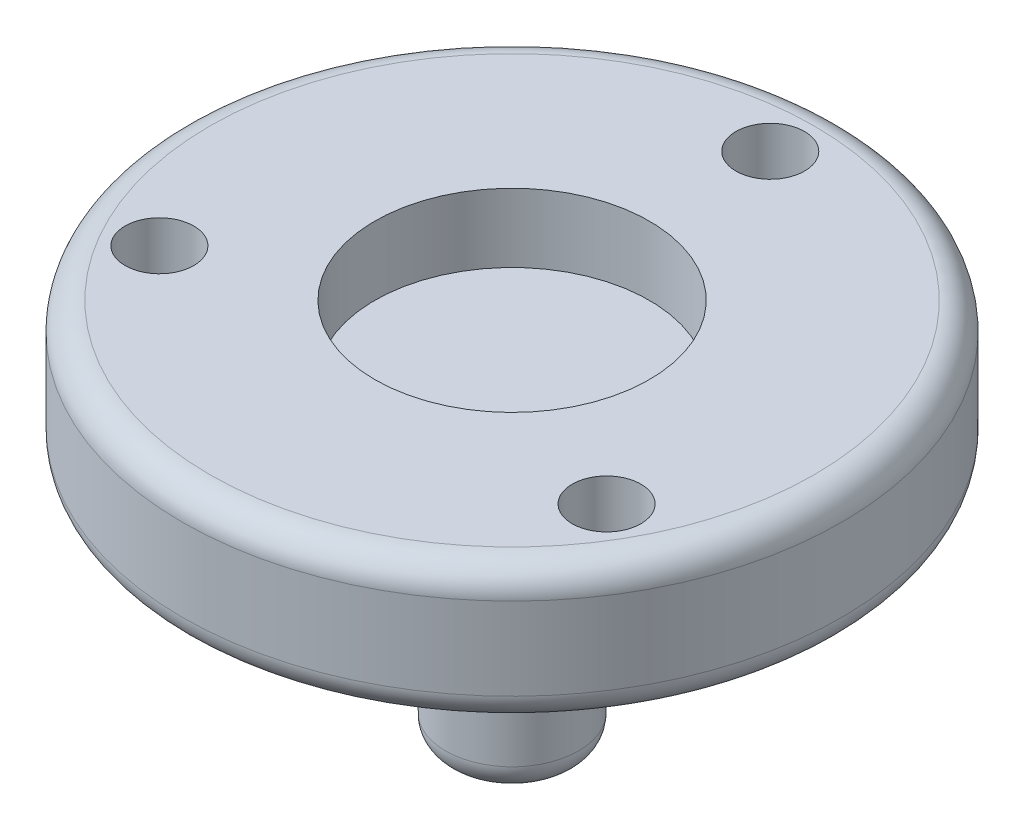
ISO-10303-21;
HEADER;
FILE_DESCRIPTION(('STEP AP214'),'2;1');
FILE_NAME('part.step','',(''),(''),'','','');
FILE_SCHEMA(('AUTOMOTIVE_DESIGN { 1 0 10303 214 1 1 1 1 }'));
ENDSEC;
DATA;
#1=APPLICATION_CONTEXT('core data for automotive mechanical design processes');
#2=APPLICATION_PROTOCOL_DEFINITION('international standard','automotive_design',2000,#1);
#3=PRODUCT_CONTEXT('',#1,'mechanical');
#4=PRODUCT('Part','Part','',(#3));
#5=PRODUCT_RELATED_PRODUCT_CATEGORY('part','',(#4));
#6=PRODUCT_DEFINITION_FORMATION('','',#4);
#7=PRODUCT_DEFINITION_CONTEXT('part definition',#1,'design');
#8=PRODUCT_DEFINITION('design','',#6,#7);
#9=PRODUCT_DEFINITION_SHAPE('','',#8);
#10=(LENGTH_UNIT() NAMED_UNIT(*) SI_UNIT(.MILLI.,.METRE.));
#11=(NAMED_UNIT(*) PLANE_ANGLE_UNIT() SI_UNIT($,.RADIAN.));
#12=(NAMED_UNIT(*) SI_UNIT($,.STERADIAN.) SOLID_ANGLE_UNIT());
#13=UNCERTAINTY_MEASURE_WITH_UNIT(LENGTH_MEASURE(1.E-05),#10,'distance_accuracy_value','');
#14=(GEOMETRIC_REPRESENTATION_CONTEXT(3) GLOBAL_UNCERTAINTY_ASSIGNED_CONTEXT((#13)) GLOBAL_UNIT_ASSIGNED_CONTEXT((#10,
#11,#12)) REPRESENTATION_CONTEXT('',''));
#15=CARTESIAN_POINT('',(0.,0.,0.));
#16=DIRECTION('',(0.,0.,1.));
#17=DIRECTION('',(1.,0.,0.));
#18=AXIS2_PLACEMENT_3D('',#15,#16,#17);
#19=CARTESIAN_POINT('',(0.,6.35,0.));
#20=DIRECTION('',(0.,-1.,0.));
#21=DIRECTION('',(0.,0.,-1.));
#22=AXIS2_PLACEMENT_3D('',#19,#20,#21);
#23=CYLINDRICAL_SURFACE('',#22,15.24);
#24=CARTESIAN_POINT('',(0.,1.27,0.));
#25=DIRECTION('',(0.,1.,0.));
#26=DIRECTION('',(0.,0.,1.));
#27=AXIS2_PLACEMENT_3D('',#24,#25,#26);
#28=CIRCLE('',#27,15.24);
#29=CARTESIAN_POINT('',(0.,1.27,15.24));
#30=VERTEX_POINT('',#29);
#31=EDGE_CURVE('E49',#30,#30,#28,.T.);
#32=ORIENTED_EDGE('',*,*,#31,.T.);
#33=EDGE_LOOP('',(#32));
#34=FACE_BOUND('',#33,.T.);
#35=CARTESIAN_POINT('',(0.,5.08,0.));
#36=DIRECTION('',(0.,1.,0.));
#37=DIRECTION('',(0.,0.,1.));
#38=AXIS2_PLACEMENT_3D('',#35,#36,#37);
#39=CIRCLE('',#38,15.24);
#40=CARTESIAN_POINT('',(0.,5.08,15.24));
#41=VERTEX_POINT('',#40);
#42=EDGE_CURVE('E68',#41,#41,#39,.F.);
#43=ORIENTED_EDGE('',*,*,#42,.T.);
#44=EDGE_LOOP('',(#43));
#45=FACE_BOUND('',#44,.T.);
#46=ADVANCED_FACE('F36',(#34,#45),#23,.T.);
#47=CARTESIAN_POINT('',(0.,6.35,0.));
#48=DIRECTION('',(0.,1.,0.));
#49=DIRECTION('',(0.,0.,1.));
#50=AXIS2_PLACEMENT_3D('',#47,#48,#49);
#51=PLANE('',#50);
#52=CARTESIAN_POINT('',(10.3386112703786,6.35,5.96900000000005));
#53=DIRECTION('',(0.,1.,0.));
#54=DIRECTION('',(-0.866025403784436,0.,-0.500000000000004));
#55=AXIS2_PLACEMENT_3D('',#52,#53,#54);
#56=CIRCLE('',#55,1.5875);
#57=CARTESIAN_POINT('',(8.96379594187081,6.35,5.17525000000004));
#58=VERTEX_POINT('',#57);
#59=EDGE_CURVE('E101',#58,#58,#56,.T.);
#60=ORIENTED_EDGE('',*,*,#59,.F.);
#61=EDGE_LOOP('',(#60));
#62=FACE_BOUND('',#61,.T.);
#63=CARTESIAN_POINT('',(-10.3386112703787,6.35,5.9689999999999));
#64=DIRECTION('',(0.,1.,0.));
#65=DIRECTION('',(0.866025403784443,0.,-0.499999999999992));
#66=AXIS2_PLACEMENT_3D('',#63,#64,#65);
#67=CIRCLE('',#66,1.5875);
#68=CARTESIAN_POINT('',(-8.96379594187088,6.35,5.17524999999992));
#69=VERTEX_POINT('',#68);
#70=EDGE_CURVE('E93',#69,#69,#67,.T.);
#71=ORIENTED_EDGE('',*,*,#70,.F.);
#72=EDGE_LOOP('',(#71));
#73=FACE_BOUND('',#72,.T.);
#74=CARTESIAN_POINT('',(0.,6.35,-11.938));
#75=DIRECTION('',(0.,1.,0.));
#76=DIRECTION('',(0.,0.,1.));
#77=AXIS2_PLACEMENT_3D('',#74,#75,#76);
#78=CIRCLE('',#77,1.5875);
#79=CARTESIAN_POINT('',(0.,6.35,-10.3505));
#80=VERTEX_POINT('',#79);
#81=EDGE_CURVE('E85',#80,#80,#78,.T.);
#82=ORIENTED_EDGE('',*,*,#81,.F.);
#83=EDGE_LOOP('',(#82));
#84=FACE_BOUND('',#83,.T.);
#85=CARTESIAN_POINT('',(0.,6.35,0.));
#86=DIRECTION('',(0.,1.,0.));
#87=DIRECTION('',(0.,0.,1.));
#88=AXIS2_PLACEMENT_3D('',#85,#86,#87);
#89=CIRCLE('',#88,13.97);
#90=CARTESIAN_POINT('',(0.,6.35,13.97));
#91=VERTEX_POINT('',#90);
#92=EDGE_CURVE('E72',#91,#91,#89,.T.);
#93=ORIENTED_EDGE('',*,*,#92,.T.);
#94=EDGE_LOOP('',(#93));
#95=FACE_BOUND('',#94,.T.);
#96=CARTESIAN_POINT('',(0.,6.35,0.));
#97=DIRECTION('',(0.,1.,0.));
#98=DIRECTION('',(0.,0.,1.));
#99=AXIS2_PLACEMENT_3D('',#96,#97,#98);
#100=CIRCLE('',#99,6.35);
#101=CARTESIAN_POINT('',(0.,6.35,6.35));
#102=VERTEX_POINT('',#101);
#103=EDGE_CURVE('E77',#102,#102,#100,.T.);
#104=ORIENTED_EDGE('',*,*,#103,.F.);
#105=EDGE_LOOP('',(#104));
#106=FACE_BOUND('',#105,.T.);
#107=ADVANCED_FACE('F118',(#62,#73,#84,#95,#106),#51,.T.);
#108=CARTESIAN_POINT('',(0.,0.,0.));
#109=DIRECTION('',(0.,1.,0.));
#110=DIRECTION('',(0.,0.,1.));
#111=AXIS2_PLACEMENT_3D('',#108,#109,#110);
#112=PLANE('',#111);
#113=CARTESIAN_POINT('',(0.,0.,0.));
#114=DIRECTION('',(0.,1.,0.));
#115=DIRECTION('',(0.,0.,1.));
#116=AXIS2_PLACEMENT_3D('',#113,#114,#115);
#117=CIRCLE('',#116,13.97);
#118=CARTESIAN_POINT('',(0.,0.,13.97));
#119=VERTEX_POINT('',#118);
#120=EDGE_CURVE('E10',#119,#119,#117,.F.);
#121=ORIENTED_EDGE('',*,*,#120,.T.);
#122=EDGE_LOOP('',(#121));
#123=FACE_BOUND('',#122,.T.);
#124=CARTESIAN_POINT('',(0.,0.,0.));
#125=DIRECTION('',(0.,1.,0.));
#126=DIRECTION('',(0.,0.,1.));
#127=AXIS2_PLACEMENT_3D('',#124,#125,#126);
#128=CIRCLE('',#127,4.3434);
#129=CARTESIAN_POINT('',(0.,0.,4.3434));
#130=VERTEX_POINT('',#129);
#131=EDGE_CURVE('E44',#130,#130,#128,.T.);
#132=ORIENTED_EDGE('',*,*,#131,.T.);
#133=EDGE_LOOP('',(#132));
#134=FACE_BOUND('',#133,.T.);
#135=ADVANCED_FACE('F121',(#123,#134),#112,.F.);
#136=CARTESIAN_POINT('',(0.,3.175,0.));
#137=DIRECTION('',(0.,1.,0.));
#138=DIRECTION('',(0.,0.,1.));
#139=AXIS2_PLACEMENT_3D('',#136,#137,#138);
#140=CYLINDRICAL_SURFACE('',#139,6.35);
#141=CARTESIAN_POINT('',(0.,3.175,0.));
#142=DIRECTION('',(0.,1.,0.));
#143=DIRECTION('',(0.,0.,1.));
#144=AXIS2_PLACEMENT_3D('',#141,#142,#143);
#145=CIRCLE('',#144,6.35);
#146=CARTESIAN_POINT('',(0.,3.175,6.35));
#147=VERTEX_POINT('',#146);
#148=EDGE_CURVE('E76',#147,#147,#145,.T.);
#149=ORIENTED_EDGE('',*,*,#148,.F.);
#150=EDGE_LOOP('',(#149));
#151=FACE_BOUND('',#150,.T.);
#152=ORIENTED_EDGE('',*,*,#103,.T.);
#153=EDGE_LOOP('',(#152));
#154=FACE_BOUND('',#153,.T.);
#155=ADVANCED_FACE('F131',(#151,#154),#140,.F.);
#156=CARTESIAN_POINT('',(0.,3.175,0.));
#157=DIRECTION('',(0.,1.,0.));
#158=DIRECTION('',(0.,0.,1.));
#159=AXIS2_PLACEMENT_3D('',#156,#157,#158);
#160=PLANE('',#159);
#161=ORIENTED_EDGE('',*,*,#148,.T.);
#162=EDGE_LOOP('',(#161));
#163=FACE_BOUND('',#162,.T.);
#164=ADVANCED_FACE('F133',(#163),#160,.T.);
#165=CARTESIAN_POINT('',(0.,5.08,0.));
#166=DIRECTION('',(0.,1.,0.));
#167=DIRECTION('',(0.,0.,1.));
#168=AXIS2_PLACEMENT_3D('',#165,#166,#167);
#169=TOROIDAL_SURFACE('',#168,13.97,1.27);
#170=ORIENTED_EDGE('',*,*,#42,.F.);
#171=EDGE_LOOP('',(#170));
#172=FACE_BOUND('',#171,.T.);
#173=ORIENTED_EDGE('',*,*,#92,.F.);
#174=EDGE_LOOP('',(#173));
#175=FACE_BOUND('',#174,.T.);
#176=ADVANCED_FACE('F140',(#172,#175),#169,.T.);
#177=CARTESIAN_POINT('',(0.,-11.43,0.));
#178=DIRECTION('',(0.,1.,0.));
#179=DIRECTION('',(0.,0.,1.));
#180=AXIS2_PLACEMENT_3D('',#177,#178,#179);
#181=CYLINDRICAL_SURFACE('',#180,3.0734);
#182=CARTESIAN_POINT('',(0.,-10.16,0.));
#183=DIRECTION('',(0.,-1.,0.));
#184=DIRECTION('',(0.,0.,-1.));
#185=AXIS2_PLACEMENT_3D('',#182,#183,#184);
#186=CIRCLE('',#185,3.0734);
#187=CARTESIAN_POINT('',(0.,-10.16,-3.0734));
#188=VERTEX_POINT('',#187);
#189=EDGE_CURVE('E54',#188,#188,#186,.F.);
#190=ORIENTED_EDGE('',*,*,#189,.T.);
#191=EDGE_LOOP('',(#190));
#192=FACE_BOUND('',#191,.T.);
#193=CARTESIAN_POINT('',(0.,-1.27,0.));
#194=DIRECTION('',(0.,1.,0.));
#195=DIRECTION('',(0.,0.,1.));
#196=AXIS2_PLACEMENT_3D('',#193,#194,#195);
#197=CIRCLE('',#196,3.0734);
#198=CARTESIAN_POINT('',(0.,-1.27,3.0734));
#199=VERTEX_POINT('',#198);
#200=EDGE_CURVE('E60',#199,#199,#197,.F.);
#201=ORIENTED_EDGE('',*,*,#200,.T.);
#202=EDGE_LOOP('',(#201));
#203=FACE_BOUND('',#202,.T.);
#204=ADVANCED_FACE('F154',(#192,#203),#181,.T.);
#205=CARTESIAN_POINT('',(0.,-11.43,0.));
#206=DIRECTION('',(0.,-1.,0.));
#207=DIRECTION('',(0.,0.,-1.));
#208=AXIS2_PLACEMENT_3D('',#205,#206,#207);
#209=PLANE('',#208);
#210=CARTESIAN_POINT('',(0.,-11.43,0.));
#211=DIRECTION('',(0.,-1.,0.));
#212=DIRECTION('',(0.,0.,-1.));
#213=AXIS2_PLACEMENT_3D('',#210,#211,#212);
#214=CIRCLE('',#213,1.8034);
#215=CARTESIAN_POINT('',(0.,-11.43,-1.8034));
#216=VERTEX_POINT('',#215);
#217=EDGE_CURVE('E64',#216,#216,#214,.T.);
#218=ORIENTED_EDGE('',*,*,#217,.T.);
#219=EDGE_LOOP('',(#218));
#220=FACE_BOUND('',#219,.T.);
#221=ADVANCED_FACE('F159',(#220),#209,.T.);
#222=CARTESIAN_POINT('',(0.,-10.16,0.));
#223=DIRECTION('',(0.,-1.,0.));
#224=DIRECTION('',(0.,0.,-1.));
#225=AXIS2_PLACEMENT_3D('',#222,#223,#224);
#226=TOROIDAL_SURFACE('',#225,1.8034,1.27);
#227=ORIENTED_EDGE('',*,*,#189,.F.);
#228=EDGE_LOOP('',(#227));
#229=FACE_BOUND('',#228,.T.);
#230=ORIENTED_EDGE('',*,*,#217,.F.);
#231=EDGE_LOOP('',(#230));
#232=FACE_BOUND('',#231,.T.);
#233=ADVANCED_FACE('F156',(#229,#232),#226,.T.);
#234=CARTESIAN_POINT('',(0.,1.27,0.));
#235=DIRECTION('',(0.,1.,0.));
#236=DIRECTION('',(0.,0.,1.));
#237=AXIS2_PLACEMENT_3D('',#234,#235,#236);
#238=TOROIDAL_SURFACE('',#237,13.97,1.27);
#239=ORIENTED_EDGE('',*,*,#120,.F.);
#240=EDGE_LOOP('',(#239));
#241=FACE_BOUND('',#240,.T.);
#242=ORIENTED_EDGE('',*,*,#31,.F.);
#243=EDGE_LOOP('',(#242));
#244=FACE_BOUND('',#243,.T.);
#245=ADVANCED_FACE('F158',(#241,#244),#238,.T.);
#246=CARTESIAN_POINT('',(0.,-1.27,0.));
#247=DIRECTION('',(0.,1.,0.));
#248=DIRECTION('',(0.,0.,1.));
#249=AXIS2_PLACEMENT_3D('',#246,#247,#248);
#250=TOROIDAL_SURFACE('',#249,4.3434,1.27);
#251=ORIENTED_EDGE('',*,*,#131,.F.);
#252=EDGE_LOOP('',(#251));
#253=FACE_BOUND('',#252,.T.);
#254=ORIENTED_EDGE('',*,*,#200,.F.);
#255=EDGE_LOOP('',(#254));
#256=FACE_BOUND('',#255,.T.);
#257=ADVANCED_FACE('F38',(#253,#256),#250,.F.);
#258=CARTESIAN_POINT('',(0.,3.81,-11.938));
#259=DIRECTION('',(0.,1.,0.));
#260=DIRECTION('',(0.,0.,1.));
#261=AXIS2_PLACEMENT_3D('',#258,#259,#260);
#262=CYLINDRICAL_SURFACE('',#261,1.5875);
#263=CARTESIAN_POINT('',(0.,3.81,-11.938));
#264=DIRECTION('',(0.,1.,0.));
#265=DIRECTION('',(0.,0.,1.));
#266=AXIS2_PLACEMENT_3D('',#263,#264,#265);
#267=CIRCLE('',#266,1.5875);
#268=CARTESIAN_POINT('',(0.,3.81,-10.3505));
#269=VERTEX_POINT('',#268);
#270=EDGE_CURVE('E81',#269,#269,#267,.T.);
#271=ORIENTED_EDGE('',*,*,#270,.F.);
#272=EDGE_LOOP('',(#271));
#273=FACE_BOUND('',#272,.T.);
#274=ORIENTED_EDGE('',*,*,#81,.T.);
#275=EDGE_LOOP('',(#274));
#276=FACE_BOUND('',#275,.T.);
#277=ADVANCED_FACE('F166',(#273,#276),#262,.F.);
#278=CARTESIAN_POINT('',(0.,3.81,-11.938));
#279=DIRECTION('',(0.,1.,0.));
#280=DIRECTION('',(0.,0.,1.));
#281=AXIS2_PLACEMENT_3D('',#278,#279,#280);
#282=PLANE('',#281);
#283=ORIENTED_EDGE('',*,*,#270,.T.);
#284=EDGE_LOOP('',(#283));
#285=FACE_BOUND('',#284,.T.);
#286=ADVANCED_FACE('F173',(#285),#282,.T.);
#287=CARTESIAN_POINT('',(-10.3386112703787,3.81,5.9689999999999));
#288=DIRECTION('',(0.,1.,0.));
#289=DIRECTION('',(0.,0.,1.));
#290=AXIS2_PLACEMENT_3D('',#287,#288,#289);
#291=CYLINDRICAL_SURFACE('',#290,1.5875);
#292=CARTESIAN_POINT('',(-10.3386112703787,3.81,5.9689999999999));
#293=DIRECTION('',(0.,1.,0.));
#294=DIRECTION('',(0.866025403784443,0.,-0.499999999999992));
#295=AXIS2_PLACEMENT_3D('',#292,#293,#294);
#296=CIRCLE('',#295,1.5875);
#297=CARTESIAN_POINT('',(-8.96379594187088,3.81,5.17524999999992));
#298=VERTEX_POINT('',#297);
#299=EDGE_CURVE('E97',#298,#298,#296,.T.);
#300=ORIENTED_EDGE('',*,*,#299,.F.);
#301=EDGE_LOOP('',(#300));
#302=FACE_BOUND('',#301,.T.);
#303=ORIENTED_EDGE('',*,*,#70,.T.);
#304=EDGE_LOOP('',(#303));
#305=FACE_BOUND('',#304,.T.);
#306=ADVANCED_FACE('F190',(#302,#305),#291,.F.);
#307=CARTESIAN_POINT('',(-10.3386112703787,3.81,5.9689999999999));
#308=DIRECTION('',(0.,1.,0.));
#309=DIRECTION('',(0.866025403784443,0.,-0.499999999999992));
#310=AXIS2_PLACEMENT_3D('',#307,#308,#309);
#311=PLANE('',#310);
#312=ORIENTED_EDGE('',*,*,#299,.T.);
#313=EDGE_LOOP('',(#312));
#314=FACE_BOUND('',#313,.T.);
#315=ADVANCED_FACE('F114',(#314),#311,.T.);
#316=CARTESIAN_POINT('',(10.3386112703786,3.81,5.96900000000005));
#317=DIRECTION('',(0.,1.,0.));
#318=DIRECTION('',(0.,0.,1.));
#319=AXIS2_PLACEMENT_3D('',#316,#317,#318);
#320=CYLINDRICAL_SURFACE('',#319,1.5875);
#321=CARTESIAN_POINT('',(10.3386112703786,3.81,5.96900000000005));
#322=DIRECTION('',(0.,1.,0.));
#323=DIRECTION('',(-0.866025403784436,0.,-0.500000000000004));
#324=AXIS2_PLACEMENT_3D('',#321,#322,#323);
#325=CIRCLE('',#324,1.5875);
#326=CARTESIAN_POINT('',(8.96379594187081,3.81,5.17525000000004));
#327=VERTEX_POINT('',#326);
#328=EDGE_CURVE('E89',#327,#327,#325,.T.);
#329=ORIENTED_EDGE('',*,*,#328,.F.);
#330=EDGE_LOOP('',(#329));
#331=FACE_BOUND('',#330,.T.);
#332=ORIENTED_EDGE('',*,*,#59,.T.);
#333=EDGE_LOOP('',(#332));
#334=FACE_BOUND('',#333,.T.);
#335=ADVANCED_FACE('F111',(#331,#334),#320,.F.);
#336=CARTESIAN_POINT('',(10.3386112703786,3.81,5.96900000000005));
#337=DIRECTION('',(0.,1.,0.));
#338=DIRECTION('',(-0.866025403784436,0.,-0.500000000000004));
#339=AXIS2_PLACEMENT_3D('',#336,#337,#338);
#340=PLANE('',#339);
#341=ORIENTED_EDGE('',*,*,#328,.T.);
#342=EDGE_LOOP('',(#341));
#343=FACE_BOUND('',#342,.T.);
#344=ADVANCED_FACE('F109',(#343),#340,.T.);
#345=CLOSED_SHELL('',(#46,#107,#135,#155,#164,#176,#204,#221,#233,#245,#257,#277,#286,#306,#315,
#335,#344));
#346=MANIFOLD_SOLID_BREP('B2',#345);
#347=ADVANCED_BREP_SHAPE_REPRESENTATION('',(#18,#346),#14);
#348=SHAPE_DEFINITION_REPRESENTATION(#9,#347);
ENDSEC;
END-ISO-10303-21;
